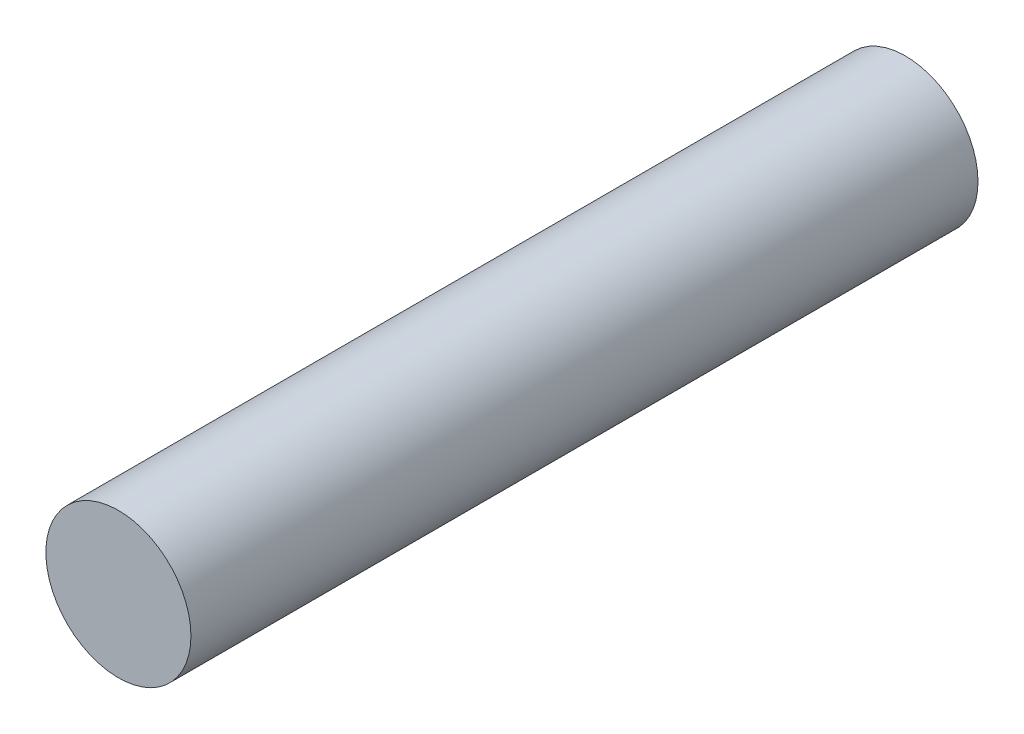
ISO-10303-21;
HEADER;
FILE_DESCRIPTION(('STEP AP214'),'2;1');
FILE_NAME('part.step','',(''),(''),'','','');
FILE_SCHEMA(('AUTOMOTIVE_DESIGN { 1 0 10303 214 1 1 1 1 }'));
ENDSEC;
DATA;
#1=APPLICATION_CONTEXT('core data for automotive mechanical design processes');
#2=APPLICATION_PROTOCOL_DEFINITION('international standard','automotive_design',2000,#1);
#3=PRODUCT_CONTEXT('',#1,'mechanical');
#4=PRODUCT('Part','Part','',(#3));
#5=PRODUCT_RELATED_PRODUCT_CATEGORY('part','',(#4));
#6=PRODUCT_DEFINITION_FORMATION('','',#4);
#7=PRODUCT_DEFINITION_CONTEXT('part definition',#1,'design');
#8=PRODUCT_DEFINITION('design','',#6,#7);
#9=PRODUCT_DEFINITION_SHAPE('','',#8);
#10=(LENGTH_UNIT() NAMED_UNIT(*) SI_UNIT(.MILLI.,.METRE.));
#11=(NAMED_UNIT(*) PLANE_ANGLE_UNIT() SI_UNIT($,.RADIAN.));
#12=(NAMED_UNIT(*) SI_UNIT($,.STERADIAN.) SOLID_ANGLE_UNIT());
#13=UNCERTAINTY_MEASURE_WITH_UNIT(LENGTH_MEASURE(1.E-05),#10,'distance_accuracy_value','');
#14=(GEOMETRIC_REPRESENTATION_CONTEXT(3) GLOBAL_UNCERTAINTY_ASSIGNED_CONTEXT((#13)) GLOBAL_UNIT_ASSIGNED_CONTEXT((#10,
#11,#12)) REPRESENTATION_CONTEXT('',''));
#15=CARTESIAN_POINT('',(0.,0.,0.));
#16=DIRECTION('',(0.,0.,1.));
#17=DIRECTION('',(1.,0.,0.));
#18=AXIS2_PLACEMENT_3D('',#15,#16,#17);
#19=CARTESIAN_POINT('',(0.,0.,35.));
#20=DIRECTION('',(0.,0.,1.));
#21=DIRECTION('',(1.,0.,0.));
#22=AXIS2_PLACEMENT_3D('',#19,#20,#21);
#23=PLANE('',#22);
#24=CARTESIAN_POINT('',(0.,0.,35.));
#25=DIRECTION('',(0.,0.,-1.));
#26=DIRECTION('',(1.,0.,0.));
#27=AXIS2_PLACEMENT_3D('',#24,#25,#26);
#28=CIRCLE('',#27,10.);
#29=CARTESIAN_POINT('',(-9.9498743710662,-1.,35.));
#30=VERTEX_POINT('',#29);
#31=CARTESIAN_POINT('',(-10.,0.,35.));
#32=VERTEX_POINT('',#31);
#33=EDGE_CURVE('E535',#30,#32,#28,.T.);
#34=ORIENTED_EDGE('',*,*,#33,.F.);
#35=DIRECTION('',(1.,0.,0.));
#36=VECTOR('',#35,1.);
#37=CARTESIAN_POINT('',(-11.5,-1.,35.));
#38=LINE('',#37,#36);
#39=CARTESIAN_POINT('',(-10.,-1.,35.));
#40=VERTEX_POINT('',#39);
#41=EDGE_CURVE('E64',#30,#40,#38,.F.);
#42=ORIENTED_EDGE('',*,*,#41,.T.);
#43=DIRECTION('',(0.,-1.,0.));
#44=VECTOR('',#43,1.);
#45=CARTESIAN_POINT('',(-10.,2.5,35.));
#46=LINE('',#45,#44);
#47=EDGE_CURVE('E491',#40,#32,#46,.F.);
#48=ORIENTED_EDGE('',*,*,#47,.T.);
#49=EDGE_LOOP('',(#34,#42,#48));
#50=FACE_BOUND('',#49,.T.);
#51=ADVANCED_FACE('F45',(#50),#23,.F.);
#52=CARTESIAN_POINT('',(0.,0.,70.));
#53=DIRECTION('',(0.,0.,1.));
#54=DIRECTION('',(1.,0.,0.));
#55=AXIS2_PLACEMENT_3D('',#52,#53,#54);
#56=PLANE('',#55);
#57=DIRECTION('',(0.,-1.,0.));
#58=VECTOR('',#57,1.);
#59=CARTESIAN_POINT('',(-10.,0.,70.));
#60=LINE('',#59,#58);
#61=CARTESIAN_POINT('',(-10.,0.,70.));
#62=VERTEX_POINT('',#61);
#63=CARTESIAN_POINT('',(-10.,-1.,70.));
#64=VERTEX_POINT('',#63);
#65=EDGE_CURVE('E463',#62,#64,#60,.T.);
#66=ORIENTED_EDGE('',*,*,#65,.T.);
#67=DIRECTION('',(1.,0.,0.));
#68=VECTOR('',#67,1.);
#69=CARTESIAN_POINT('',(0.,-1.,70.));
#70=LINE('',#69,#68);
#71=CARTESIAN_POINT('',(-9.9498743710662,-1.,70.));
#72=VERTEX_POINT('',#71);
#73=EDGE_CURVE('E466',#64,#72,#70,.T.);
#74=ORIENTED_EDGE('',*,*,#73,.T.);
#75=CARTESIAN_POINT('',(0.,0.,70.));
#76=DIRECTION('',(0.,0.,-1.));
#77=DIRECTION('',(1.,0.,0.));
#78=AXIS2_PLACEMENT_3D('',#75,#76,#77);
#79=CIRCLE('',#78,10.);
#80=EDGE_CURVE('E518',#72,#62,#79,.T.);
#81=ORIENTED_EDGE('',*,*,#80,.T.);
#82=EDGE_LOOP('',(#66,#74,#81));
#83=FACE_BOUND('',#82,.T.);
#84=ADVANCED_FACE('F343',(#83),#56,.T.);
#85=CARTESIAN_POINT('',(-11.5,2.5,35.));
#86=DIRECTION('',(-1.,0.,0.));
#87=DIRECTION('',(0.,0.,1.));
#88=AXIS2_PLACEMENT_3D('',#85,#86,#87);
#89=PLANE('',#88);
#90=DIRECTION('',(0.,0.,1.));
#91=VECTOR('',#90,1.);
#92=CARTESIAN_POINT('',(-11.5,-2.5,35.));
#93=LINE('',#92,#91);
#94=CARTESIAN_POINT('',(-11.5,-2.5,36.5));
#95=VERTEX_POINT('',#94);
#96=CARTESIAN_POINT('',(-11.5,-2.5,68.5));
#97=VERTEX_POINT('',#96);
#98=EDGE_CURVE('E547',#95,#97,#93,.T.);
#99=ORIENTED_EDGE('',*,*,#98,.T.);
#100=DIRECTION('',(0.,-1.,0.));
#101=VECTOR('',#100,1.);
#102=CARTESIAN_POINT('',(-11.5,2.5,68.5));
#103=LINE('',#102,#101);
#104=CARTESIAN_POINT('',(-11.5,2.5,68.5));
#105=VERTEX_POINT('',#104);
#106=EDGE_CURVE('E480',#97,#105,#103,.F.);
#107=ORIENTED_EDGE('',*,*,#106,.T.);
#108=DIRECTION('',(0.,0.,1.));
#109=VECTOR('',#108,1.);
#110=CARTESIAN_POINT('',(-11.5,2.5,35.));
#111=LINE('',#110,#109);
#112=CARTESIAN_POINT('',(-11.5,2.5,36.5));
#113=VERTEX_POINT('',#112);
#114=EDGE_CURVE('E538',#113,#105,#111,.T.);
#115=ORIENTED_EDGE('',*,*,#114,.F.);
#116=DIRECTION('',(0.,-1.,0.));
#117=VECTOR('',#116,1.);
#118=CARTESIAN_POINT('',(-11.5,-2.5,36.5));
#119=LINE('',#118,#117);
#120=EDGE_CURVE('E477',#113,#95,#119,.T.);
#121=ORIENTED_EDGE('',*,*,#120,.T.);
#122=EDGE_LOOP('',(#99,#107,#115,#121));
#123=FACE_BOUND('',#122,.T.);
#124=ADVANCED_FACE('F350',(#123),#89,.T.);
#125=CARTESIAN_POINT('',(-9.68245836551854,2.5,35.));
#126=DIRECTION('',(0.,1.,0.));
#127=DIRECTION('',(0.,0.,1.));
#128=AXIS2_PLACEMENT_3D('',#125,#126,#127);
#129=PLANE('',#128);
#130=ORIENTED_EDGE('',*,*,#114,.T.);
#131=DIRECTION('',(-1.,0.,0.));
#132=VECTOR('',#131,1.);
#133=CARTESIAN_POINT('',(-9.68245836551854,2.5,68.5));
#134=LINE('',#133,#132);
#135=CARTESIAN_POINT('',(-9.68245836551854,2.5,68.5));
#136=VERTEX_POINT('',#135);
#137=EDGE_CURVE('E486',#105,#136,#134,.F.);
#138=ORIENTED_EDGE('',*,*,#137,.T.);
#139=DIRECTION('',(0.,0.,1.));
#140=VECTOR('',#139,1.);
#141=CARTESIAN_POINT('',(-9.68245836551854,2.5,35.));
#142=LINE('',#141,#140);
#143=CARTESIAN_POINT('',(-9.68245836551854,2.5,36.5));
#144=VERTEX_POINT('',#143);
#145=EDGE_CURVE('E511',#144,#136,#142,.T.);
#146=ORIENTED_EDGE('',*,*,#145,.F.);
#147=DIRECTION('',(-1.,0.,0.));
#148=VECTOR('',#147,1.);
#149=CARTESIAN_POINT('',(-11.5,2.5,36.5));
#150=LINE('',#149,#148);
#151=EDGE_CURVE('E483',#144,#113,#150,.T.);
#152=ORIENTED_EDGE('',*,*,#151,.T.);
#153=EDGE_LOOP('',(#130,#138,#146,#152));
#154=FACE_BOUND('',#153,.T.);
#155=ADVANCED_FACE('F640',(#154),#129,.T.);
#156=CARTESIAN_POINT('',(-9.68245836551854,-2.5,35.));
#157=DIRECTION('',(0.,-1.,0.));
#158=DIRECTION('',(0.,0.,-1.));
#159=AXIS2_PLACEMENT_3D('',#156,#157,#158);
#160=PLANE('',#159);
#161=DIRECTION('',(0.,0.,1.));
#162=VECTOR('',#161,1.);
#163=CARTESIAN_POINT('',(-9.68245836551854,-2.5,35.));
#164=LINE('',#163,#162);
#165=CARTESIAN_POINT('',(-9.68245836551854,-2.5,36.5));
#166=VERTEX_POINT('',#165);
#167=CARTESIAN_POINT('',(-9.68245836551854,-2.5,68.5));
#168=VERTEX_POINT('',#167);
#169=EDGE_CURVE('E544',#166,#168,#164,.T.);
#170=ORIENTED_EDGE('',*,*,#169,.T.);
#171=DIRECTION('',(1.,0.,0.));
#172=VECTOR('',#171,1.);
#173=CARTESIAN_POINT('',(-9.68245836551854,-2.5,68.5));
#174=LINE('',#173,#172);
#175=EDGE_CURVE('E474',#168,#97,#174,.F.);
#176=ORIENTED_EDGE('',*,*,#175,.T.);
#177=ORIENTED_EDGE('',*,*,#98,.F.);
#178=DIRECTION('',(1.,0.,0.));
#179=VECTOR('',#178,1.);
#180=CARTESIAN_POINT('',(-9.68245836551854,-2.5,36.5));
#181=LINE('',#180,#179);
#182=EDGE_CURVE('E470',#95,#166,#181,.T.);
#183=ORIENTED_EDGE('',*,*,#182,.T.);
#184=EDGE_LOOP('',(#170,#176,#177,#183));
#185=FACE_BOUND('',#184,.T.);
#186=ADVANCED_FACE('F568',(#185),#160,.T.);
#187=CARTESIAN_POINT('',(0.,0.,11.5));
#188=DIRECTION('',(0.,0.,1.));
#189=DIRECTION('',(1.,0.,0.));
#190=AXIS2_PLACEMENT_3D('',#187,#188,#189);
#191=PLANE('',#190);
#192=DIRECTION('',(0.,-1.,0.));
#193=VECTOR('',#192,1.);
#194=CARTESIAN_POINT('',(-10.,0.,11.5));
#195=LINE('',#194,#193);
#196=CARTESIAN_POINT('',(-10.,0.,11.5));
#197=VERTEX_POINT('',#196);
#198=CARTESIAN_POINT('',(-10.,-1.,11.5));
#199=VERTEX_POINT('',#198);
#200=EDGE_CURVE('E247',#197,#199,#195,.T.);
#201=ORIENTED_EDGE('',*,*,#200,.T.);
#202=DIRECTION('',(1.,0.,0.));
#203=VECTOR('',#202,1.);
#204=CARTESIAN_POINT('',(0.,-0.999999999999999,11.5));
#205=LINE('',#204,#203);
#206=CARTESIAN_POINT('',(-9.9498743710662,-1.,11.5));
#207=VERTEX_POINT('',#206);
#208=EDGE_CURVE('E187',#199,#207,#205,.T.);
#209=ORIENTED_EDGE('',*,*,#208,.T.);
#210=CARTESIAN_POINT('',(0.,0.,11.5));
#211=DIRECTION('',(0.,0.,1.));
#212=DIRECTION('',(1.,0.,0.));
#213=AXIS2_PLACEMENT_3D('',#210,#211,#212);
#214=CIRCLE('',#213,10.);
#215=EDGE_CURVE('E207',#207,#197,#214,.F.);
#216=ORIENTED_EDGE('',*,*,#215,.T.);
#217=EDGE_LOOP('',(#201,#209,#216));
#218=FACE_BOUND('',#217,.T.);
#219=ADVANCED_FACE('F379',(#218),#191,.T.);
#220=CARTESIAN_POINT('',(0.,0.,-11.5));
#221=DIRECTION('',(0.,0.,1.));
#222=DIRECTION('',(1.,0.,0.));
#223=AXIS2_PLACEMENT_3D('',#220,#221,#222);
#224=PLANE('',#223);
#225=CARTESIAN_POINT('',(0.,0.,-11.5));
#226=DIRECTION('',(0.,0.,1.));
#227=DIRECTION('',(1.,0.,0.));
#228=AXIS2_PLACEMENT_3D('',#225,#226,#227);
#229=CIRCLE('',#228,10.);
#230=CARTESIAN_POINT('',(-9.9498743710662,-1.,-11.5));
#231=VERTEX_POINT('',#230);
#232=CARTESIAN_POINT('',(-10.,0.,-11.5));
#233=VERTEX_POINT('',#232);
#234=EDGE_CURVE('E222',#231,#233,#229,.F.);
#235=ORIENTED_EDGE('',*,*,#234,.F.);
#236=DIRECTION('',(1.,0.,0.));
#237=VECTOR('',#236,1.);
#238=CARTESIAN_POINT('',(-11.5,-1.,-11.5));
#239=LINE('',#238,#237);
#240=CARTESIAN_POINT('',(-10.,-1.,-11.5));
#241=VERTEX_POINT('',#240);
#242=EDGE_CURVE('E180',#231,#241,#239,.F.);
#243=ORIENTED_EDGE('',*,*,#242,.T.);
#244=DIRECTION('',(0.,-1.,0.));
#245=VECTOR('',#244,1.);
#246=CARTESIAN_POINT('',(-10.,2.5,-11.5));
#247=LINE('',#246,#245);
#248=EDGE_CURVE('E227',#241,#233,#247,.F.);
#249=ORIENTED_EDGE('',*,*,#248,.T.);
#250=EDGE_LOOP('',(#235,#243,#249));
#251=FACE_BOUND('',#250,.T.);
#252=ADVANCED_FACE('F277',(#251),#224,.F.);
#253=CARTESIAN_POINT('',(0.,0.,-23.5));
#254=DIRECTION('',(0.,0.,1.));
#255=DIRECTION('',(1.,0.,0.));
#256=AXIS2_PLACEMENT_3D('',#253,#254,#255);
#257=CYLINDRICAL_SURFACE('',#256,10.);
#258=CARTESIAN_POINT('',(0.,0.,85.));
#259=DIRECTION('',(0.,0.,1.));
#260=DIRECTION('',(1.,0.,0.));
#261=AXIS2_PLACEMENT_3D('',#258,#259,#260);
#262=CIRCLE('',#261,10.);
#263=CARTESIAN_POINT('',(10.,0.,85.));
#264=VERTEX_POINT('',#263);
#265=EDGE_CURVE('E456',#264,#264,#262,.T.);
#266=ORIENTED_EDGE('',*,*,#265,.F.);
#267=EDGE_LOOP('',(#266));
#268=FACE_BOUND('',#267,.T.);
#269=CARTESIAN_POINT('',(-9.9498743710662,1.,35.));
#270=VERTEX_POINT('',#269);
#271=EDGE_CURVE('E533',#32,#270,#28,.T.);
#272=ORIENTED_EDGE('',*,*,#271,.T.);
#273=CARTESIAN_POINT('',(-9.9498743710662,1.,35.));
#274=CARTESIAN_POINT('',(-9.94560370191053,1.04250805702428,35.0000001071127));
#275=CARTESIAN_POINT('',(-9.94105939457216,1.08496676968035,35.0018079762154));
#276=CARTESIAN_POINT('',(-9.93146702997806,1.16951621026432,35.0090051088368));
#277=CARTESIAN_POINT('',(-9.92641904470779,1.21160698984454,35.0143938611985));
#278=CARTESIAN_POINT('',(-9.91060597799517,1.33675909156229,35.0358497157049));
#279=CARTESIAN_POINT('',(-9.89915272874075,1.4188883792664,35.0572067458813));
#280=CARTESIAN_POINT('',(-9.87501131119567,1.57818294506003,35.1133323911645));
#281=CARTESIAN_POINT('',(-9.86232309990088,1.65534805013015,35.1481014734338));
#282=CARTESIAN_POINT('',(-9.83645491819786,1.80270698447464,35.2300527042761));
#283=CARTESIAN_POINT('',(-9.82327489915944,1.87290012183121,35.2772360831869));
#284=CARTESIAN_POINT('',(-9.7971478838574,2.00511618830587,35.3833076626493));
#285=CARTESIAN_POINT('',(-9.78420482767416,2.06704483123248,35.4423144056153));
#286=CARTESIAN_POINT('',(-9.75963429953695,2.18011329825206,35.5701543768942));
#287=CARTESIAN_POINT('',(-9.74800701230908,2.23125160831599,35.6389889819197));
#288=CARTESIAN_POINT('',(-9.72703768837474,2.32096036813432,35.7842376712468));
#289=CARTESIAN_POINT('',(-9.71768441811601,2.35959292340185,35.8606117635634));
#290=CARTESIAN_POINT('',(-9.70197865541583,2.42336495769354,36.0190554919755));
#291=CARTESIAN_POINT('',(-9.69562335413844,2.44851706974047,36.1011197138819));
#292=CARTESIAN_POINT('',(-9.68821441517447,2.47762607069535,36.2365045605414));
#293=CARTESIAN_POINT('',(-9.68606326268518,2.48600777738418,36.2888548854825));
#294=CARTESIAN_POINT('',(-9.68318267443164,2.49719519637901,36.3941277446299));
#295=CARTESIAN_POINT('',(-9.68245167598436,2.50000703761819,36.447049585384));
#296=CARTESIAN_POINT('',(-9.68245836551854,2.5,36.5));
#297=B_SPLINE_CURVE_WITH_KNOTS('',3,(#273,#274,#275,#276,#277,#278,#279,#280,#281,#282,#283,
#284,#285,#286,#287,#288,#289,#290,#291,#292,#293,#294,#295,#296),.UNSPECIFIED.,.F.,.F.,(4,2,2,
2,2,2,2,2,2,2,2,4),(0.,0.12808462419373,0.256150968731953,0.511723487013052,0.767304908084201,
1.02291166848888,1.28122243660014,1.53956942512458,1.7966130052588,2.05341527725797,
2.21230687561403,2.37102353650248),.UNSPECIFIED.);
#298=EDGE_CURVE('E11',#270,#144,#297,.T.);
#299=ORIENTED_EDGE('',*,*,#298,.T.);
#300=ORIENTED_EDGE('',*,*,#145,.T.);
#301=CARTESIAN_POINT('',(-9.68245836551854,2.5,68.5));
#302=CARTESIAN_POINT('',(-9.68245666508018,2.50000046989785,68.5413966129109));
#303=CARTESIAN_POINT('',(-9.682901291099,2.49828521162087,68.5827728444829));
#304=CARTESIAN_POINT('',(-9.6846635898383,2.49144730494671,68.6652180404885));
#305=CARTESIAN_POINT('',(-9.68598113483426,2.48632515504165,68.7062870489857));
#306=CARTESIAN_POINT('',(-9.6912042244055,2.46592167897722,68.8284244601584));
#307=CARTESIAN_POINT('',(-9.69638044510992,2.44560301113306,68.9086568522681));
#308=CARTESIAN_POINT('',(-9.70969376993008,2.39219437611658,69.0644340937495));
#309=CARTESIAN_POINT('',(-9.71783091392486,2.35910423693199,69.1399788799705));
#310=CARTESIAN_POINT('',(-9.73642058999694,2.28116498153595,69.2844432671648));
#311=CARTESIAN_POINT('',(-9.74687359531041,2.2363134615931,69.3533615098993));
#312=CARTESIAN_POINT('',(-9.76951949924154,2.13523101988469,69.48396779567));
#313=CARTESIAN_POINT('',(-9.7817401784084,2.07881087999305,69.5455044375181));
#314=CARTESIAN_POINT('',(-9.80690762694568,1.956641654665,69.6583406068708));
#315=CARTESIAN_POINT('',(-9.8198545930301,1.89089003435823,69.709637343592));
#316=CARTESIAN_POINT('',(-9.84592196218152,1.7501585705456,69.8017294805287));
#317=CARTESIAN_POINT('',(-9.85903931085684,1.67499845499529,69.8422503590784));
#318=CARTESIAN_POINT('',(-9.88430794405126,1.51878287905936,69.9100007445168));
#319=CARTESIAN_POINT('',(-9.89645982393707,1.43773111181701,69.9372384966838));
#320=CARTESIAN_POINT('',(-9.915713085704,1.29694142931084,69.9715256145193));
#321=CARTESIAN_POINT('',(-9.92323509907125,1.23811435536981,69.9821815482914));
#322=CARTESIAN_POINT('',(-9.93731377545196,1.11955362919814,69.996421077526));
#323=CARTESIAN_POINT('',(-9.94387132060737,1.05982086122274,70.0000111733837));
#324=CARTESIAN_POINT('',(-9.9498743710662,1.,70.));
#325=B_SPLINE_CURVE_WITH_KNOTS('',3,(#301,#302,#303,#304,#305,#306,#307,#308,#309,#310,#311,
#312,#313,#314,#315,#316,#317,#318,#319,#320,#321,#322,#323,#324),.UNSPECIFIED.,.F.,.F.,(4,2,2,
2,2,2,2,2,2,2,2,4),(0.,0.124111759190374,0.248205362497236,0.495700874158684,0.74319971932436,
0.990749186526348,1.24272719848051,1.49477379103711,1.75273199161094,2.01052986448941,
2.19089092434182,2.37108597880062),.UNSPECIFIED.);
#326=CARTESIAN_POINT('',(-9.9498743710662,1.,70.));
#327=VERTEX_POINT('',#326);
#328=EDGE_CURVE('E309',#136,#327,#325,.T.);
#329=ORIENTED_EDGE('',*,*,#328,.T.);
#330=EDGE_CURVE('E508',#62,#327,#79,.T.);
#331=ORIENTED_EDGE('',*,*,#330,.F.);
#332=ORIENTED_EDGE('',*,*,#80,.F.);
#333=CARTESIAN_POINT('',(-9.9498743710662,-1.,70.));
#334=CARTESIAN_POINT('',(-9.94560370191053,-1.04250805702428,69.9999998928873));
#335=CARTESIAN_POINT('',(-9.94105939457216,-1.08496676968035,69.9981920237846));
#336=CARTESIAN_POINT('',(-9.93146702997806,-1.16951621026432,69.9909948911631));
#337=CARTESIAN_POINT('',(-9.92641904470779,-1.21160698984454,69.9856061388015));
#338=CARTESIAN_POINT('',(-9.91060597799517,-1.33675909156229,69.9641502842951));
#339=CARTESIAN_POINT('',(-9.89915272874075,-1.4188883792664,69.9427932541186));
#340=CARTESIAN_POINT('',(-9.87501131119567,-1.57818294506003,69.8866676088354));
#341=CARTESIAN_POINT('',(-9.86232309990089,-1.65534805013014,69.8518985265662));
#342=CARTESIAN_POINT('',(-9.83645491819786,-1.80270698447464,69.7699472957239));
#343=CARTESIAN_POINT('',(-9.82327489915944,-1.8729001218312,69.7227639168131));
#344=CARTESIAN_POINT('',(-9.7971478838574,-2.00511618830587,69.6166923373507));
#345=CARTESIAN_POINT('',(-9.78420482767416,-2.06704483123248,69.5576855943847));
#346=CARTESIAN_POINT('',(-9.75963429953695,-2.18011329825205,69.4298456231058));
#347=CARTESIAN_POINT('',(-9.74800701230908,-2.23125160831598,69.3610110180803));
#348=CARTESIAN_POINT('',(-9.72703768837475,-2.32096036813432,69.2157623287532));
#349=CARTESIAN_POINT('',(-9.71768441811601,-2.35959292340184,69.1393882364366));
#350=CARTESIAN_POINT('',(-9.70197865541583,-2.42336495769354,68.9809445080245));
#351=CARTESIAN_POINT('',(-9.69562335413844,-2.44851706974047,68.8988802861181));
#352=CARTESIAN_POINT('',(-9.68821441517447,-2.47762607069535,68.7634954394586));
#353=CARTESIAN_POINT('',(-9.68606326268519,-2.48600777738418,68.7111451145175));
#354=CARTESIAN_POINT('',(-9.68318267443165,-2.497195196379,68.6058722553701));
#355=CARTESIAN_POINT('',(-9.68245167598436,-2.50000703761818,68.552950414616));
#356=CARTESIAN_POINT('',(-9.68245836551854,-2.5,68.5));
#357=B_SPLINE_CURVE_WITH_KNOTS('',3,(#333,#334,#335,#336,#337,#338,#339,#340,#341,#342,#343,
#344,#345,#346,#347,#348,#349,#350,#351,#352,#353,#354,#355,#356),.UNSPECIFIED.,.F.,.F.,(4,2,2,
2,2,2,2,2,2,2,2,4),(0.,0.128084624193729,0.256150968731952,0.511723487013052,0.767304908084195,
1.02291166848888,1.28122243660014,1.53956942512457,1.7966130052588,2.05341527725797,
2.21230687561402,2.37102353650247),.UNSPECIFIED.);
#358=EDGE_CURVE('E301',#72,#168,#357,.T.);
#359=ORIENTED_EDGE('',*,*,#358,.T.);
#360=ORIENTED_EDGE('',*,*,#169,.F.);
#361=CARTESIAN_POINT('',(-9.68245836551854,-2.5,36.5));
#362=CARTESIAN_POINT('',(-9.68245666508018,-2.50000046989785,36.4586033870891));
#363=CARTESIAN_POINT('',(-9.682901291099,-2.49828521162087,36.4172271555171));
#364=CARTESIAN_POINT('',(-9.6846635898383,-2.49144730494671,36.3347819595115));
#365=CARTESIAN_POINT('',(-9.68598113483426,-2.48632515504165,36.2937129510143));
#366=CARTESIAN_POINT('',(-9.6912042244055,-2.46592167897722,36.1715755398416));
#367=CARTESIAN_POINT('',(-9.69638044510992,-2.44560301113306,36.0913431477319));
#368=CARTESIAN_POINT('',(-9.70969376993008,-2.39219437611659,35.9355659062505));
#369=CARTESIAN_POINT('',(-9.71783091392486,-2.35910423693199,35.8600211200295));
#370=CARTESIAN_POINT('',(-9.73642058999694,-2.28116498153596,35.7155567328352));
#371=CARTESIAN_POINT('',(-9.74687359531041,-2.2363134615931,35.6466384901007));
#372=CARTESIAN_POINT('',(-9.76951949924154,-2.13523101988469,35.51603220433));
#373=CARTESIAN_POINT('',(-9.78174017840839,-2.07881087999305,35.4544955624819));
#374=CARTESIAN_POINT('',(-9.80690762694568,-1.956641654665,35.3416593931292));
#375=CARTESIAN_POINT('',(-9.8198545930301,-1.89089003435824,35.290362656408));
#376=CARTESIAN_POINT('',(-9.84592196218152,-1.75015857054561,35.1982705194713));
#377=CARTESIAN_POINT('',(-9.85903931085684,-1.67499845499529,35.1577496409215));
#378=CARTESIAN_POINT('',(-9.88430794405126,-1.51878287905936,35.0899992554832));
#379=CARTESIAN_POINT('',(-9.89645982393707,-1.43773111181701,35.0627615033162));
#380=CARTESIAN_POINT('',(-9.915713085704,-1.29694142931085,35.0284743854806));
#381=CARTESIAN_POINT('',(-9.92323509907125,-1.23811435536982,35.0178184517086));
#382=CARTESIAN_POINT('',(-9.93731377545196,-1.11955362919814,35.003578922474));
#383=CARTESIAN_POINT('',(-9.94387132060738,-1.05982086122274,34.9999888266163));
#384=CARTESIAN_POINT('',(-9.9498743710662,-1.,35.));
#385=B_SPLINE_CURVE_WITH_KNOTS('',3,(#361,#362,#363,#364,#365,#366,#367,#368,#369,#370,#371,
#372,#373,#374,#375,#376,#377,#378,#379,#380,#381,#382,#383,#384),.UNSPECIFIED.,.F.,.F.,(4,2,2,
2,2,2,2,2,2,2,2,4),(0.,0.124111759190381,0.248205362497229,0.495700874158677,0.743199719324345,
0.990749186526345,1.2427271984805,1.49477379103711,1.75273199161094,2.0105298644894,
2.19089092434182,2.37108597880063),.UNSPECIFIED.);
#386=EDGE_CURVE('E56',#166,#30,#385,.T.);
#387=ORIENTED_EDGE('',*,*,#386,.T.);
#388=ORIENTED_EDGE('',*,*,#33,.T.);
#389=EDGE_LOOP('',(#272,#299,#300,#329,#331,#332,#359,#360,#387,#388));
#390=FACE_BOUND('',#389,.T.);
#391=CARTESIAN_POINT('',(0.,0.,-23.5));
#392=DIRECTION('',(0.,0.,1.));
#393=DIRECTION('',(1.,0.,0.));
#394=AXIS2_PLACEMENT_3D('',#391,#392,#393);
#395=CIRCLE('',#394,10.);
#396=CARTESIAN_POINT('',(10.,0.,-23.5));
#397=VERTEX_POINT('',#396);
#398=EDGE_CURVE('E421',#397,#397,#395,.T.);
#399=ORIENTED_EDGE('',*,*,#398,.T.);
#400=EDGE_LOOP('',(#399));
#401=FACE_BOUND('',#400,.T.);
#402=DIRECTION('',(0.,0.,1.));
#403=VECTOR('',#402,1.);
#404=CARTESIAN_POINT('',(-9.68245836551854,-2.5,-23.5));
#405=LINE('',#404,#403);
#406=CARTESIAN_POINT('',(-9.68245836551854,-2.5,-10.));
#407=VERTEX_POINT('',#406);
#408=CARTESIAN_POINT('',(-9.68245836551854,-2.5,10.));
#409=VERTEX_POINT('',#408);
#410=EDGE_CURVE('E193',#407,#409,#405,.T.);
#411=ORIENTED_EDGE('',*,*,#410,.F.);
#412=CARTESIAN_POINT('',(-9.68245836551854,-2.5,-10.));
#413=CARTESIAN_POINT('',(-9.68245666508018,-2.50000046989785,-10.0413966129109));
#414=CARTESIAN_POINT('',(-9.682901291099,-2.49828521162087,-10.0827728444829));
#415=CARTESIAN_POINT('',(-9.6846635898383,-2.49144730494671,-10.1652180404885));
#416=CARTESIAN_POINT('',(-9.68598113483426,-2.48632515504165,-10.2062870489857));
#417=CARTESIAN_POINT('',(-9.6912042244055,-2.46592167897722,-10.3284244601584));
#418=CARTESIAN_POINT('',(-9.69638044510992,-2.44560301113306,-10.4086568522681));
#419=CARTESIAN_POINT('',(-9.70969376993008,-2.39219437611658,-10.5644340937495));
#420=CARTESIAN_POINT('',(-9.71783091392486,-2.35910423693199,-10.6399788799705));
#421=CARTESIAN_POINT('',(-9.73642058999694,-2.28116498153595,-10.7844432671648));
#422=CARTESIAN_POINT('',(-9.74687359531041,-2.2363134615931,-10.8533615098993));
#423=CARTESIAN_POINT('',(-9.76951949924154,-2.13523101988469,-10.98396779567));
#424=CARTESIAN_POINT('',(-9.78174017840839,-2.07881087999305,-11.0455044375181));
#425=CARTESIAN_POINT('',(-9.80690762694568,-1.956641654665,-11.1583406068708));
#426=CARTESIAN_POINT('',(-9.8198545930301,-1.89089003435823,-11.209637343592));
#427=CARTESIAN_POINT('',(-9.84592196218152,-1.7501585705456,-11.3017294805287));
#428=CARTESIAN_POINT('',(-9.85903931085684,-1.67499845499529,-11.3422503590785));
#429=CARTESIAN_POINT('',(-9.88430794405126,-1.51878287905935,-11.4100007445168));
#430=CARTESIAN_POINT('',(-9.89645982393707,-1.43773111181701,-11.4372384966838));
#431=CARTESIAN_POINT('',(-9.915713085704,-1.29694142931084,-11.4715256145193));
#432=CARTESIAN_POINT('',(-9.92323509907125,-1.23811435536981,-11.4821815482914));
#433=CARTESIAN_POINT('',(-9.93731377545196,-1.11955362919814,-11.496421077526));
#434=CARTESIAN_POINT('',(-9.94387132060738,-1.05982086122274,-11.5000111733837));
#435=CARTESIAN_POINT('',(-9.9498743710662,-1.,-11.5));
#436=B_SPLINE_CURVE_WITH_KNOTS('',3,(#412,#413,#414,#415,#416,#417,#418,#419,#420,#421,#422,
#423,#424,#425,#426,#427,#428,#429,#430,#431,#432,#433,#434,#435),.UNSPECIFIED.,.F.,.F.,(4,2,2,
2,2,2,2,2,2,2,2,4),(0.,0.124111759190381,0.248205362497229,0.495700874158681,0.743199719324353,
0.990749186526351,1.24272719848051,1.49477379103711,1.75273199161094,2.01052986448941,
2.19089092434182,2.37108597880063),.UNSPECIFIED.);
#437=EDGE_CURVE('E175',#407,#231,#436,.T.);
#438=ORIENTED_EDGE('',*,*,#437,.T.);
#439=ORIENTED_EDGE('',*,*,#234,.T.);
#440=CARTESIAN_POINT('',(-9.9498743710662,0.999999999999999,-11.5));
#441=VERTEX_POINT('',#440);
#442=EDGE_CURVE('E212',#233,#441,#229,.F.);
#443=ORIENTED_EDGE('',*,*,#442,.T.);
#444=CARTESIAN_POINT('',(-9.9498743710662,0.999999999999999,-11.5));
#445=CARTESIAN_POINT('',(-9.94560370191053,1.04250805702428,-11.4999998928873));
#446=CARTESIAN_POINT('',(-9.94105939457216,1.08496676968035,-11.4981920237846));
#447=CARTESIAN_POINT('',(-9.93146702997806,1.16951621026432,-11.4909948911632));
#448=CARTESIAN_POINT('',(-9.92641904470779,1.21160698984454,-11.4856061388015));
#449=CARTESIAN_POINT('',(-9.91060597799517,1.33675909156229,-11.4641502842951));
#450=CARTESIAN_POINT('',(-9.89915272874075,1.4188883792664,-11.4427932541187));
#451=CARTESIAN_POINT('',(-9.87501131119567,1.57818294506003,-11.3866676088354));
#452=CARTESIAN_POINT('',(-9.86232309990089,1.65534805013014,-11.3518985265662));
#453=CARTESIAN_POINT('',(-9.83645491819786,1.80270698447464,-11.2699472957239));
#454=CARTESIAN_POINT('',(-9.82327489915944,1.8729001218312,-11.2227639168131));
#455=CARTESIAN_POINT('',(-9.7971478838574,2.00511618830587,-11.1166923373507));
#456=CARTESIAN_POINT('',(-9.78420482767416,2.06704483123248,-11.0576855943847));
#457=CARTESIAN_POINT('',(-9.75963429953695,2.18011329825206,-10.9298456231058));
#458=CARTESIAN_POINT('',(-9.74800701230908,2.23125160831599,-10.8610110180803));
#459=CARTESIAN_POINT('',(-9.72703768837475,2.32096036813432,-10.7157623287532));
#460=CARTESIAN_POINT('',(-9.71768441811601,2.35959292340184,-10.6393882364366));
#461=CARTESIAN_POINT('',(-9.70197865541584,2.42336495769353,-10.4809445080245));
#462=CARTESIAN_POINT('',(-9.69562335413844,2.44851706974047,-10.3988802861181));
#463=CARTESIAN_POINT('',(-9.68821441517447,2.47762607069535,-10.2634954394586));
#464=CARTESIAN_POINT('',(-9.68606326268519,2.48600777738418,-10.2111451145175));
#465=CARTESIAN_POINT('',(-9.68318267443165,2.497195196379,-10.1058722553701));
#466=CARTESIAN_POINT('',(-9.68245167598436,2.50000703761818,-10.052950414616));
#467=CARTESIAN_POINT('',(-9.68245836551854,2.5,-10.));
#468=B_SPLINE_CURVE_WITH_KNOTS('',3,(#444,#445,#446,#447,#448,#449,#450,#451,#452,#453,#454,
#455,#456,#457,#458,#459,#460,#461,#462,#463,#464,#465,#466,#467),.UNSPECIFIED.,.F.,.F.,(4,2,2,
2,2,2,2,2,2,2,2,4),(0.,0.128084624193729,0.256150968731953,0.511723487013052,0.767304908084198,
1.02291166848888,1.28122243660015,1.53956942512458,1.7966130052588,2.05341527725797,
2.21230687561403,2.37102353650249),.UNSPECIFIED.);
#469=CARTESIAN_POINT('',(-9.68245836551854,2.5,-10.));
#470=VERTEX_POINT('',#469);
#471=EDGE_CURVE('E186',#441,#470,#468,.T.);
#472=ORIENTED_EDGE('',*,*,#471,.T.);
#473=DIRECTION('',(0.,0.,1.));
#474=VECTOR('',#473,1.);
#475=CARTESIAN_POINT('',(-9.68245836551854,2.5,-23.5));
#476=LINE('',#475,#474);
#477=CARTESIAN_POINT('',(-9.68245836551854,2.5,10.));
#478=VERTEX_POINT('',#477);
#479=EDGE_CURVE('E206',#478,#470,#476,.F.);
#480=ORIENTED_EDGE('',*,*,#479,.F.);
#481=CARTESIAN_POINT('',(-9.68245836551854,2.5,10.));
#482=CARTESIAN_POINT('',(-9.68245666508018,2.50000046989785,10.0413966129109));
#483=CARTESIAN_POINT('',(-9.682901291099,2.49828521162087,10.0827728444829));
#484=CARTESIAN_POINT('',(-9.6846635898383,2.49144730494671,10.1652180404885));
#485=CARTESIAN_POINT('',(-9.68598113483426,2.48632515504165,10.2062870489857));
#486=CARTESIAN_POINT('',(-9.6912042244055,2.46592167897722,10.3284244601584));
#487=CARTESIAN_POINT('',(-9.69638044510992,2.44560301113306,10.4086568522681));
#488=CARTESIAN_POINT('',(-9.70969376993008,2.39219437611658,10.5644340937495));
#489=CARTESIAN_POINT('',(-9.71783091392486,2.35910423693199,10.6399788799705));
#490=CARTESIAN_POINT('',(-9.73642058999694,2.28116498153595,10.7844432671648));
#491=CARTESIAN_POINT('',(-9.74687359531041,2.2363134615931,10.8533615098993));
#492=CARTESIAN_POINT('',(-9.76951949924154,2.13523101988469,10.98396779567));
#493=CARTESIAN_POINT('',(-9.78174017840839,2.07881087999304,11.0455044375181));
#494=CARTESIAN_POINT('',(-9.80690762694568,1.956641654665,11.1583406068708));
#495=CARTESIAN_POINT('',(-9.8198545930301,1.89089003435823,11.209637343592));
#496=CARTESIAN_POINT('',(-9.84592196218152,1.7501585705456,11.3017294805287));
#497=CARTESIAN_POINT('',(-9.85903931085684,1.67499845499529,11.3422503590785));
#498=CARTESIAN_POINT('',(-9.88430794405126,1.51878287905935,11.4100007445168));
#499=CARTESIAN_POINT('',(-9.89645982393707,1.43773111181701,11.4372384966838));
#500=CARTESIAN_POINT('',(-9.915713085704,1.29694142931084,11.4715256145193));
#501=CARTESIAN_POINT('',(-9.92323509907125,1.23811435536981,11.4821815482914));
#502=CARTESIAN_POINT('',(-9.93731377545196,1.11955362919814,11.496421077526));
#503=CARTESIAN_POINT('',(-9.94387132060738,1.05982086122274,11.5000111733837));
#504=CARTESIAN_POINT('',(-9.9498743710662,0.999999999999999,11.5));
#505=B_SPLINE_CURVE_WITH_KNOTS('',3,(#481,#482,#483,#484,#485,#486,#487,#488,#489,#490,#491,
#492,#493,#494,#495,#496,#497,#498,#499,#500,#501,#502,#503,#504),.UNSPECIFIED.,.F.,.F.,(4,2,2,
2,2,2,2,2,2,2,2,4),(0.,0.124111759190381,0.248205362497229,0.495700874158681,0.743199719324353,
0.990749186526351,1.24272719848051,1.49477379103711,1.75273199161094,2.01052986448941,
2.19089092434182,2.37108597880063),.UNSPECIFIED.);
#506=CARTESIAN_POINT('',(-9.9498743710662,0.999999999999999,11.5));
#507=VERTEX_POINT('',#506);
#508=EDGE_CURVE('E292',#478,#507,#505,.T.);
#509=ORIENTED_EDGE('',*,*,#508,.T.);
#510=EDGE_CURVE('E215',#197,#507,#214,.F.);
#511=ORIENTED_EDGE('',*,*,#510,.F.);
#512=ORIENTED_EDGE('',*,*,#215,.F.);
#513=CARTESIAN_POINT('',(-9.9498743710662,-1.,11.5));
#514=CARTESIAN_POINT('',(-9.94560370191053,-1.04250805702428,11.4999998928873));
#515=CARTESIAN_POINT('',(-9.94105939457216,-1.08496676968035,11.4981920237846));
#516=CARTESIAN_POINT('',(-9.93146702997806,-1.16951621026432,11.4909948911632));
#517=CARTESIAN_POINT('',(-9.92641904470779,-1.21160698984454,11.4856061388015));
#518=CARTESIAN_POINT('',(-9.91060597799517,-1.33675909156229,11.4641502842951));
#519=CARTESIAN_POINT('',(-9.89915272874075,-1.4188883792664,11.4427932541187));
#520=CARTESIAN_POINT('',(-9.87501131119567,-1.57818294506003,11.3866676088354));
#521=CARTESIAN_POINT('',(-9.86232309990089,-1.65534805013015,11.3518985265662));
#522=CARTESIAN_POINT('',(-9.83645491819786,-1.80270698447464,11.2699472957239));
#523=CARTESIAN_POINT('',(-9.82327489915944,-1.87290012183121,11.2227639168131));
#524=CARTESIAN_POINT('',(-9.7971478838574,-2.00511618830587,11.1166923373507));
#525=CARTESIAN_POINT('',(-9.78420482767416,-2.06704483123248,11.0576855943847));
#526=CARTESIAN_POINT('',(-9.75963429953695,-2.18011329825206,10.9298456231058));
#527=CARTESIAN_POINT('',(-9.74800701230908,-2.23125160831599,10.8610110180803));
#528=CARTESIAN_POINT('',(-9.72703768837475,-2.32096036813432,10.7157623287532));
#529=CARTESIAN_POINT('',(-9.71768441811601,-2.35959292340184,10.6393882364366));
#530=CARTESIAN_POINT('',(-9.70197865541583,-2.42336495769354,10.4809445080245));
#531=CARTESIAN_POINT('',(-9.69562335413845,-2.44851706974047,10.3988802861181));
#532=CARTESIAN_POINT('',(-9.68821441517447,-2.47762607069535,10.2634954394586));
#533=CARTESIAN_POINT('',(-9.68606326268518,-2.48600777738418,10.2111451145175));
#534=CARTESIAN_POINT('',(-9.68318267443164,-2.49719519637901,10.1058722553701));
#535=CARTESIAN_POINT('',(-9.68245167598436,-2.50000703761819,10.052950414616));
#536=CARTESIAN_POINT('',(-9.68245836551854,-2.5,10.));
#537=B_SPLINE_CURVE_WITH_KNOTS('',3,(#513,#514,#515,#516,#517,#518,#519,#520,#521,#522,#523,
#524,#525,#526,#527,#528,#529,#530,#531,#532,#533,#534,#535,#536),.UNSPECIFIED.,.F.,.F.,(4,2,2,
2,2,2,2,2,2,2,2,4),(0.,0.128084624193729,0.256150968731953,0.511723487013053,0.767304908084199,
1.02291166848888,1.28122243660015,1.53956942512458,1.7966130052588,2.05341527725798,
2.21230687561403,2.37102353650248),.UNSPECIFIED.);
#538=EDGE_CURVE('E204',#207,#409,#537,.T.);
#539=ORIENTED_EDGE('',*,*,#538,.T.);
#540=EDGE_LOOP('',(#411,#438,#439,#443,#472,#480,#509,#511,#512,#539));
#541=FACE_BOUND('',#540,.T.);
#542=ADVANCED_FACE('F202',(#268,#390,#401,#541),#257,.T.);
#543=CARTESIAN_POINT('',(0.,0.,-23.5));
#544=DIRECTION('',(0.,0.,1.));
#545=DIRECTION('',(1.,0.,0.));
#546=AXIS2_PLACEMENT_3D('',#543,#544,#545);
#547=PLANE('',#546);
#548=ORIENTED_EDGE('',*,*,#398,.F.);
#549=EDGE_LOOP('',(#548));
#550=FACE_BOUND('',#549,.T.);
#551=ADVANCED_FACE('F276',(#550),#547,.F.);
#552=CARTESIAN_POINT('',(-11.5,2.5,-11.5));
#553=DIRECTION('',(0.,1.,0.));
#554=DIRECTION('',(-1.,0.,0.));
#555=AXIS2_PLACEMENT_3D('',#552,#553,#554);
#556=PLANE('',#555);
#557=ORIENTED_EDGE('',*,*,#479,.T.);
#558=DIRECTION('',(-1.,0.,0.));
#559=VECTOR('',#558,1.);
#560=CARTESIAN_POINT('',(-11.5,2.5,-10.));
#561=LINE('',#560,#559);
#562=CARTESIAN_POINT('',(-11.5,2.5,-10.));
#563=VERTEX_POINT('',#562);
#564=EDGE_CURVE('E238',#470,#563,#561,.T.);
#565=ORIENTED_EDGE('',*,*,#564,.T.);
#566=DIRECTION('',(0.,0.,1.));
#567=VECTOR('',#566,1.);
#568=CARTESIAN_POINT('',(-11.5,2.5,-11.5));
#569=LINE('',#568,#567);
#570=CARTESIAN_POINT('',(-11.5,2.5,10.));
#571=VERTEX_POINT('',#570);
#572=EDGE_CURVE('E412',#563,#571,#569,.T.);
#573=ORIENTED_EDGE('',*,*,#572,.T.);
#574=DIRECTION('',(-1.,0.,0.));
#575=VECTOR('',#574,1.);
#576=CARTESIAN_POINT('',(-11.5,2.5,10.));
#577=LINE('',#576,#575);
#578=EDGE_CURVE('E235',#571,#478,#577,.F.);
#579=ORIENTED_EDGE('',*,*,#578,.T.);
#580=EDGE_LOOP('',(#557,#565,#573,#579));
#581=FACE_BOUND('',#580,.T.);
#582=ADVANCED_FACE('F386',(#581),#556,.T.);
#583=CARTESIAN_POINT('',(-11.5,-2.5,-11.5));
#584=DIRECTION('',(0.,-1.,0.));
#585=DIRECTION('',(1.,0.,0.));
#586=AXIS2_PLACEMENT_3D('',#583,#584,#585);
#587=PLANE('',#586);
#588=DIRECTION('',(0.,0.,1.));
#589=VECTOR('',#588,1.);
#590=CARTESIAN_POINT('',(-11.5,-2.5,-11.5));
#591=LINE('',#590,#589);
#592=CARTESIAN_POINT('',(-11.5,-2.5,-10.));
#593=VERTEX_POINT('',#592);
#594=CARTESIAN_POINT('',(-11.5,-2.5,10.));
#595=VERTEX_POINT('',#594);
#596=EDGE_CURVE('E196',#593,#595,#591,.T.);
#597=ORIENTED_EDGE('',*,*,#596,.F.);
#598=DIRECTION('',(1.,0.,0.));
#599=VECTOR('',#598,1.);
#600=CARTESIAN_POINT('',(-9.68245836551854,-2.5,-10.));
#601=LINE('',#600,#599);
#602=EDGE_CURVE('E179',#593,#407,#601,.T.);
#603=ORIENTED_EDGE('',*,*,#602,.T.);
#604=ORIENTED_EDGE('',*,*,#410,.T.);
#605=DIRECTION('',(1.,0.,0.));
#606=VECTOR('',#605,1.);
#607=CARTESIAN_POINT('',(-11.5,-2.5,10.));
#608=LINE('',#607,#606);
#609=EDGE_CURVE('E200',#409,#595,#608,.F.);
#610=ORIENTED_EDGE('',*,*,#609,.T.);
#611=EDGE_LOOP('',(#597,#603,#604,#610));
#612=FACE_BOUND('',#611,.T.);
#613=ADVANCED_FACE('F192',(#612),#587,.T.);
#614=CARTESIAN_POINT('',(-11.5,-2.5,-11.5));
#615=DIRECTION('',(-1.,0.,0.));
#616=DIRECTION('',(0.,0.,1.));
#617=AXIS2_PLACEMENT_3D('',#614,#615,#616);
#618=PLANE('',#617);
#619=ORIENTED_EDGE('',*,*,#572,.F.);
#620=DIRECTION('',(0.,-1.,0.));
#621=VECTOR('',#620,1.);
#622=CARTESIAN_POINT('',(-11.5,-2.5,-10.));
#623=LINE('',#622,#621);
#624=EDGE_CURVE('E244',#563,#593,#623,.T.);
#625=ORIENTED_EDGE('',*,*,#624,.T.);
#626=ORIENTED_EDGE('',*,*,#596,.T.);
#627=DIRECTION('',(0.,-1.,0.));
#628=VECTOR('',#627,1.);
#629=CARTESIAN_POINT('',(-11.5,-2.5,10.));
#630=LINE('',#629,#628);
#631=EDGE_CURVE('E241',#595,#571,#630,.F.);
#632=ORIENTED_EDGE('',*,*,#631,.T.);
#633=EDGE_LOOP('',(#619,#625,#626,#632));
#634=FACE_BOUND('',#633,.T.);
#635=ADVANCED_FACE('F382',(#634),#618,.T.);
#636=DIRECTION('',(0.,-1.,0.));
#637=VECTOR('',#636,1.);
#638=CARTESIAN_POINT('',(-10.,2.5,-11.5));
#639=LINE('',#638,#637);
#640=CARTESIAN_POINT('',(-10.,0.999999999999999,-11.5));
#641=VERTEX_POINT('',#640);
#642=EDGE_CURVE('E199',#233,#641,#639,.F.);
#643=ORIENTED_EDGE('',*,*,#642,.T.);
#644=DIRECTION('',(-1.,0.,0.));
#645=VECTOR('',#644,1.);
#646=CARTESIAN_POINT('',(-9.68245836551854,0.999999999999999,-11.5));
#647=LINE('',#646,#645);
#648=EDGE_CURVE('E230',#641,#441,#647,.F.);
#649=ORIENTED_EDGE('',*,*,#648,.T.);
#650=ORIENTED_EDGE('',*,*,#442,.F.);
#651=EDGE_LOOP('',(#643,#649,#650));
#652=FACE_BOUND('',#651,.T.);
#653=ADVANCED_FACE('F377',(#652),#224,.F.);
#654=ORIENTED_EDGE('',*,*,#510,.T.);
#655=DIRECTION('',(-1.,0.,0.));
#656=VECTOR('',#655,1.);
#657=CARTESIAN_POINT('',(0.,1.,11.5));
#658=LINE('',#657,#656);
#659=CARTESIAN_POINT('',(-10.,0.999999999999999,11.5));
#660=VERTEX_POINT('',#659);
#661=EDGE_CURVE('E253',#507,#660,#658,.T.);
#662=ORIENTED_EDGE('',*,*,#661,.T.);
#663=DIRECTION('',(0.,-1.,0.));
#664=VECTOR('',#663,1.);
#665=CARTESIAN_POINT('',(-10.,0.,11.5));
#666=LINE('',#665,#664);
#667=EDGE_CURVE('E250',#660,#197,#666,.T.);
#668=ORIENTED_EDGE('',*,*,#667,.T.);
#669=EDGE_LOOP('',(#654,#662,#668));
#670=FACE_BOUND('',#669,.T.);
#671=ADVANCED_FACE('F373',(#670),#191,.T.);
#672=CARTESIAN_POINT('',(-11.5,0.999999999999999,-10.));
#673=DIRECTION('',(1.,0.,0.));
#674=DIRECTION('',(0.,1.,0.));
#675=AXIS2_PLACEMENT_3D('',#672,#673,#674);
#676=CYLINDRICAL_SURFACE('',#675,1.5);
#677=ORIENTED_EDGE('',*,*,#471,.F.);
#678=ORIENTED_EDGE('',*,*,#648,.F.);
#679=CARTESIAN_POINT('',(-10.,0.999999999999999,-10.));
#680=DIRECTION('',(0.707106781186547,0.707106781186548,0.));
#681=DIRECTION('',(-0.707106781186548,0.707106781186547,0.));
#682=AXIS2_PLACEMENT_3D('',#679,#680,#681);
#683=ELLIPSE('',#682,2.12132034355964,1.5);
#684=EDGE_CURVE('E407',#563,#641,#683,.F.);
#685=ORIENTED_EDGE('',*,*,#684,.F.);
#686=ORIENTED_EDGE('',*,*,#564,.F.);
#687=EDGE_LOOP('',(#677,#678,#685,#686));
#688=FACE_BOUND('',#687,.T.);
#689=ADVANCED_FACE('F376',(#688),#676,.T.);
#690=CARTESIAN_POINT('',(-10.,-2.5,-10.));
#691=DIRECTION('',(0.,1.,0.));
#692=DIRECTION('',(0.,0.,1.));
#693=AXIS2_PLACEMENT_3D('',#690,#691,#692);
#694=CYLINDRICAL_SURFACE('',#693,1.5);
#695=ORIENTED_EDGE('',*,*,#642,.F.);
#696=ORIENTED_EDGE('',*,*,#248,.F.);
#697=CARTESIAN_POINT('',(-10.,-1.,-10.));
#698=DIRECTION('',(-0.707106781186548,0.707106781186547,0.));
#699=DIRECTION('',(0.707106781186547,0.707106781186548,0.));
#700=AXIS2_PLACEMENT_3D('',#697,#698,#699);
#701=ELLIPSE('',#700,2.12132034355964,1.5);
#702=EDGE_CURVE('E413',#593,#241,#701,.F.);
#703=ORIENTED_EDGE('',*,*,#702,.F.);
#704=ORIENTED_EDGE('',*,*,#624,.F.);
#705=ORIENTED_EDGE('',*,*,#684,.T.);
#706=EDGE_LOOP('',(#695,#696,#703,#704,#705));
#707=FACE_BOUND('',#706,.T.);
#708=ADVANCED_FACE('F415',(#707),#694,.T.);
#709=CARTESIAN_POINT('',(-11.5,-1.,-10.));
#710=DIRECTION('',(-1.,0.,0.));
#711=DIRECTION('',(0.,-1.,0.));
#712=AXIS2_PLACEMENT_3D('',#709,#710,#711);
#713=CYLINDRICAL_SURFACE('',#712,1.5);
#714=ORIENTED_EDGE('',*,*,#702,.T.);
#715=ORIENTED_EDGE('',*,*,#242,.F.);
#716=ORIENTED_EDGE('',*,*,#437,.F.);
#717=ORIENTED_EDGE('',*,*,#602,.F.);
#718=EDGE_LOOP('',(#714,#715,#716,#717));
#719=FACE_BOUND('',#718,.T.);
#720=ADVANCED_FACE('F178',(#719),#713,.T.);
#721=CARTESIAN_POINT('',(0.,1.,10.));
#722=DIRECTION('',(-1.,0.,0.));
#723=DIRECTION('',(0.,-1.,0.));
#724=AXIS2_PLACEMENT_3D('',#721,#722,#723);
#725=CYLINDRICAL_SURFACE('',#724,1.5);
#726=ORIENTED_EDGE('',*,*,#508,.F.);
#727=ORIENTED_EDGE('',*,*,#578,.F.);
#728=CARTESIAN_POINT('',(-10.,0.999999999999999,10.));
#729=DIRECTION('',(-0.707106781186547,-0.707106781186548,0.));
#730=DIRECTION('',(0.707106781186548,-0.707106781186547,0.));
#731=AXIS2_PLACEMENT_3D('',#728,#729,#730);
#732=ELLIPSE('',#731,2.12132034355964,1.5);
#733=EDGE_CURVE('E437',#660,#571,#732,.T.);
#734=ORIENTED_EDGE('',*,*,#733,.F.);
#735=ORIENTED_EDGE('',*,*,#661,.F.);
#736=EDGE_LOOP('',(#726,#727,#734,#735));
#737=FACE_BOUND('',#736,.T.);
#738=ADVANCED_FACE('F435',(#737),#725,.T.);
#739=CARTESIAN_POINT('',(-10.,0.,10.));
#740=DIRECTION('',(0.,-1.,0.));
#741=DIRECTION('',(0.,0.,-1.));
#742=AXIS2_PLACEMENT_3D('',#739,#740,#741);
#743=CYLINDRICAL_SURFACE('',#742,1.5);
#744=ORIENTED_EDGE('',*,*,#733,.T.);
#745=ORIENTED_EDGE('',*,*,#631,.F.);
#746=CARTESIAN_POINT('',(-10.,-1.,10.));
#747=DIRECTION('',(0.707106781186548,-0.707106781186547,0.));
#748=DIRECTION('',(-0.707106781186547,-0.707106781186548,0.));
#749=AXIS2_PLACEMENT_3D('',#746,#747,#748);
#750=ELLIPSE('',#749,2.12132034355964,1.5);
#751=EDGE_CURVE('E440',#199,#595,#750,.T.);
#752=ORIENTED_EDGE('',*,*,#751,.F.);
#753=ORIENTED_EDGE('',*,*,#200,.F.);
#754=ORIENTED_EDGE('',*,*,#667,.F.);
#755=EDGE_LOOP('',(#744,#745,#752,#753,#754));
#756=FACE_BOUND('',#755,.T.);
#757=ADVANCED_FACE('F367',(#756),#743,.T.);
#758=CARTESIAN_POINT('',(0.,-0.999999999999999,10.));
#759=DIRECTION('',(1.,0.,0.));
#760=DIRECTION('',(0.,1.,0.));
#761=AXIS2_PLACEMENT_3D('',#758,#759,#760);
#762=CYLINDRICAL_SURFACE('',#761,1.5);
#763=ORIENTED_EDGE('',*,*,#751,.T.);
#764=ORIENTED_EDGE('',*,*,#609,.F.);
#765=ORIENTED_EDGE('',*,*,#538,.F.);
#766=ORIENTED_EDGE('',*,*,#208,.F.);
#767=EDGE_LOOP('',(#763,#764,#765,#766));
#768=FACE_BOUND('',#767,.T.);
#769=ADVANCED_FACE('F361',(#768),#762,.T.);
#770=CARTESIAN_POINT('',(0.,0.,85.));
#771=DIRECTION('',(0.,0.,1.));
#772=DIRECTION('',(1.,0.,0.));
#773=AXIS2_PLACEMENT_3D('',#770,#771,#772);
#774=PLANE('',#773);
#775=ORIENTED_EDGE('',*,*,#265,.T.);
#776=EDGE_LOOP('',(#775));
#777=FACE_BOUND('',#776,.T.);
#778=ADVANCED_FACE('F356',(#777),#774,.T.);
#779=DIRECTION('',(0.,-1.,0.));
#780=VECTOR('',#779,1.);
#781=CARTESIAN_POINT('',(-10.,2.5,35.));
#782=LINE('',#781,#780);
#783=CARTESIAN_POINT('',(-10.,1.,35.));
#784=VERTEX_POINT('',#783);
#785=EDGE_CURVE('E72',#32,#784,#782,.F.);
#786=ORIENTED_EDGE('',*,*,#785,.T.);
#787=DIRECTION('',(-1.,0.,0.));
#788=VECTOR('',#787,1.);
#789=CARTESIAN_POINT('',(-9.68245836551854,1.,35.));
#790=LINE('',#789,#788);
#791=EDGE_CURVE('E494',#784,#270,#790,.F.);
#792=ORIENTED_EDGE('',*,*,#791,.T.);
#793=ORIENTED_EDGE('',*,*,#271,.F.);
#794=EDGE_LOOP('',(#786,#792,#793));
#795=FACE_BOUND('',#794,.T.);
#796=ADVANCED_FACE('F345',(#795),#23,.F.);
#797=DIRECTION('',(-1.,0.,0.));
#798=VECTOR('',#797,1.);
#799=CARTESIAN_POINT('',(0.,1.,70.));
#800=LINE('',#799,#798);
#801=CARTESIAN_POINT('',(-10.,1.,70.));
#802=VERTEX_POINT('',#801);
#803=EDGE_CURVE('E450',#327,#802,#800,.T.);
#804=ORIENTED_EDGE('',*,*,#803,.T.);
#805=DIRECTION('',(0.,-1.,0.));
#806=VECTOR('',#805,1.);
#807=CARTESIAN_POINT('',(-10.,0.,70.));
#808=LINE('',#807,#806);
#809=EDGE_CURVE('E460',#802,#62,#808,.T.);
#810=ORIENTED_EDGE('',*,*,#809,.T.);
#811=ORIENTED_EDGE('',*,*,#330,.T.);
#812=EDGE_LOOP('',(#804,#810,#811));
#813=FACE_BOUND('',#812,.T.);
#814=ADVANCED_FACE('F353',(#813),#56,.T.);
#815=CARTESIAN_POINT('',(0.,1.,68.5));
#816=DIRECTION('',(-1.,0.,0.));
#817=DIRECTION('',(0.,0.,1.));
#818=AXIS2_PLACEMENT_3D('',#815,#816,#817);
#819=CYLINDRICAL_SURFACE('',#818,1.5);
#820=ORIENTED_EDGE('',*,*,#328,.F.);
#821=ORIENTED_EDGE('',*,*,#137,.F.);
#822=CARTESIAN_POINT('',(-10.,1.,68.5));
#823=DIRECTION('',(-0.707106781186547,-0.707106781186547,0.));
#824=DIRECTION('',(-0.707106781186547,0.707106781186547,0.));
#825=AXIS2_PLACEMENT_3D('',#822,#823,#824);
#826=ELLIPSE('',#825,2.12132034355964,1.5);
#827=EDGE_CURVE('E519',#802,#105,#826,.T.);
#828=ORIENTED_EDGE('',*,*,#827,.F.);
#829=ORIENTED_EDGE('',*,*,#803,.F.);
#830=EDGE_LOOP('',(#820,#821,#828,#829));
#831=FACE_BOUND('',#830,.T.);
#832=ADVANCED_FACE('F332',(#831),#819,.T.);
#833=CARTESIAN_POINT('',(-10.,0.,68.5));
#834=DIRECTION('',(0.,-1.,0.));
#835=DIRECTION('',(0.,0.,-1.));
#836=AXIS2_PLACEMENT_3D('',#833,#834,#835);
#837=CYLINDRICAL_SURFACE('',#836,1.5);
#838=ORIENTED_EDGE('',*,*,#827,.T.);
#839=ORIENTED_EDGE('',*,*,#106,.F.);
#840=CARTESIAN_POINT('',(-10.,-1.,68.5));
#841=DIRECTION('',(0.707106781186547,-0.707106781186547,0.));
#842=DIRECTION('',(-0.707106781186547,-0.707106781186547,0.));
#843=AXIS2_PLACEMENT_3D('',#840,#841,#842);
#844=ELLIPSE('',#843,2.12132034355964,1.5);
#845=EDGE_CURVE('E525',#64,#97,#844,.T.);
#846=ORIENTED_EDGE('',*,*,#845,.F.);
#847=ORIENTED_EDGE('',*,*,#65,.F.);
#848=ORIENTED_EDGE('',*,*,#809,.F.);
#849=EDGE_LOOP('',(#838,#839,#846,#847,#848));
#850=FACE_BOUND('',#849,.T.);
#851=ADVANCED_FACE('F528',(#850),#837,.T.);
#852=CARTESIAN_POINT('',(0.,-1.,68.5));
#853=DIRECTION('',(1.,0.,0.));
#854=DIRECTION('',(0.,0.,-1.));
#855=AXIS2_PLACEMENT_3D('',#852,#853,#854);
#856=CYLINDRICAL_SURFACE('',#855,1.5);
#857=ORIENTED_EDGE('',*,*,#845,.T.);
#858=ORIENTED_EDGE('',*,*,#175,.F.);
#859=ORIENTED_EDGE('',*,*,#358,.F.);
#860=ORIENTED_EDGE('',*,*,#73,.F.);
#861=EDGE_LOOP('',(#857,#858,#859,#860));
#862=FACE_BOUND('',#861,.T.);
#863=ADVANCED_FACE('F340',(#862),#856,.T.);
#864=CARTESIAN_POINT('',(-9.68245836551854,1.,36.5));
#865=DIRECTION('',(1.,0.,0.));
#866=DIRECTION('',(0.,0.,-1.));
#867=AXIS2_PLACEMENT_3D('',#864,#865,#866);
#868=CYLINDRICAL_SURFACE('',#867,1.5);
#869=ORIENTED_EDGE('',*,*,#298,.F.);
#870=ORIENTED_EDGE('',*,*,#791,.F.);
#871=CARTESIAN_POINT('',(-10.,1.,36.5));
#872=DIRECTION('',(0.707106781186547,0.707106781186547,0.));
#873=DIRECTION('',(-0.707106781186547,0.707106781186547,0.));
#874=AXIS2_PLACEMENT_3D('',#871,#872,#873);
#875=ELLIPSE('',#874,2.12132034355964,1.5);
#876=EDGE_CURVE('E50',#113,#784,#875,.F.);
#877=ORIENTED_EDGE('',*,*,#876,.F.);
#878=ORIENTED_EDGE('',*,*,#151,.F.);
#879=EDGE_LOOP('',(#869,#870,#877,#878));
#880=FACE_BOUND('',#879,.T.);
#881=ADVANCED_FACE('F47',(#880),#868,.T.);
#882=CARTESIAN_POINT('',(-10.,2.5,36.5));
#883=DIRECTION('',(0.,1.,0.));
#884=DIRECTION('',(0.,0.,1.));
#885=AXIS2_PLACEMENT_3D('',#882,#883,#884);
#886=CYLINDRICAL_SURFACE('',#885,1.5);
#887=ORIENTED_EDGE('',*,*,#785,.F.);
#888=ORIENTED_EDGE('',*,*,#47,.F.);
#889=CARTESIAN_POINT('',(-10.,-1.,36.5));
#890=DIRECTION('',(-0.707106781186547,0.707106781186547,0.));
#891=DIRECTION('',(0.707106781186547,0.707106781186547,0.));
#892=AXIS2_PLACEMENT_3D('',#889,#890,#891);
#893=ELLIPSE('',#892,2.12132034355964,1.5);
#894=EDGE_CURVE('E562',#95,#40,#893,.F.);
#895=ORIENTED_EDGE('',*,*,#894,.F.);
#896=ORIENTED_EDGE('',*,*,#120,.F.);
#897=ORIENTED_EDGE('',*,*,#876,.T.);
#898=EDGE_LOOP('',(#887,#888,#895,#896,#897));
#899=FACE_BOUND('',#898,.T.);
#900=ADVANCED_FACE('F330',(#899),#886,.T.);
#901=CARTESIAN_POINT('',(-9.68245836551854,-1.,36.5));
#902=DIRECTION('',(-1.,0.,0.));
#903=DIRECTION('',(0.,0.,1.));
#904=AXIS2_PLACEMENT_3D('',#901,#902,#903);
#905=CYLINDRICAL_SURFACE('',#904,1.5);
#906=ORIENTED_EDGE('',*,*,#894,.T.);
#907=ORIENTED_EDGE('',*,*,#41,.F.);
#908=ORIENTED_EDGE('',*,*,#386,.F.);
#909=ORIENTED_EDGE('',*,*,#182,.F.);
#910=EDGE_LOOP('',(#906,#907,#908,#909));
#911=FACE_BOUND('',#910,.T.);
#912=ADVANCED_FACE('F327',(#911),#905,.T.);
#913=CLOSED_SHELL('',(#51,#84,#124,#155,#186,#219,#252,#542,#551,#582,#613,#635,#653,#671,#689,
#708,#720,#738,#757,#769,#778,#796,#814,#832,#851,#863,#881,#900,#912));
#914=MANIFOLD_SOLID_BREP('B2',#913);
#915=ADVANCED_BREP_SHAPE_REPRESENTATION('',(#18,#914),#14);
#916=SHAPE_DEFINITION_REPRESENTATION(#9,#915);
ENDSEC;
END-ISO-10303-21;
